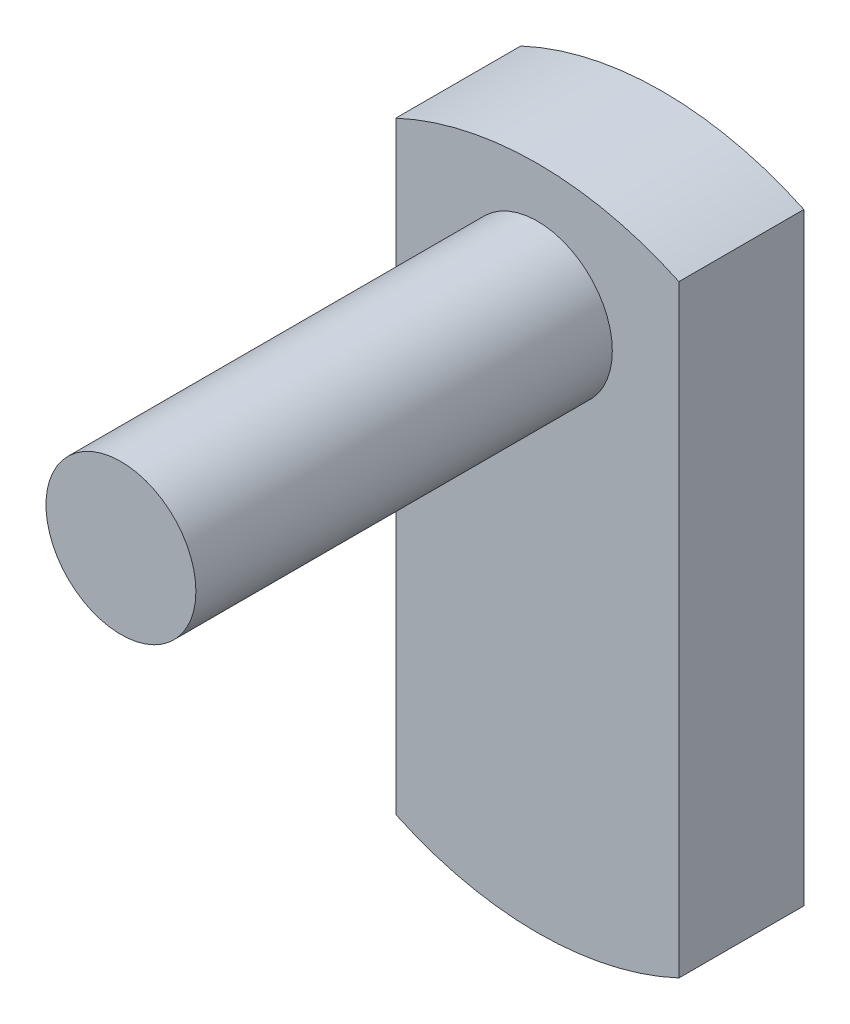
ISO-10303-21;
HEADER;
FILE_DESCRIPTION(('STEP AP214'),'2;1');
FILE_NAME('part.step','',(''),(''),'','','');
FILE_SCHEMA(('AUTOMOTIVE_DESIGN { 1 0 10303 214 1 1 1 1 }'));
ENDSEC;
DATA;
#1=APPLICATION_CONTEXT('core data for automotive mechanical design processes');
#2=APPLICATION_PROTOCOL_DEFINITION('international standard','automotive_design',2000,#1);
#3=PRODUCT_CONTEXT('',#1,'mechanical');
#4=PRODUCT('Part','Part','',(#3));
#5=PRODUCT_RELATED_PRODUCT_CATEGORY('part','',(#4));
#6=PRODUCT_DEFINITION_FORMATION('','',#4);
#7=PRODUCT_DEFINITION_CONTEXT('part definition',#1,'design');
#8=PRODUCT_DEFINITION('design','',#6,#7);
#9=PRODUCT_DEFINITION_SHAPE('','',#8);
#10=(LENGTH_UNIT() NAMED_UNIT(*) SI_UNIT(.MILLI.,.METRE.));
#11=(NAMED_UNIT(*) PLANE_ANGLE_UNIT() SI_UNIT($,.RADIAN.));
#12=(NAMED_UNIT(*) SI_UNIT($,.STERADIAN.) SOLID_ANGLE_UNIT());
#13=UNCERTAINTY_MEASURE_WITH_UNIT(LENGTH_MEASURE(1.E-05),#10,'distance_accuracy_value','');
#14=(GEOMETRIC_REPRESENTATION_CONTEXT(3) GLOBAL_UNCERTAINTY_ASSIGNED_CONTEXT((#13)) GLOBAL_UNIT_ASSIGNED_CONTEXT((#10,
#11,#12)) REPRESENTATION_CONTEXT('',''));
#15=CARTESIAN_POINT('',(0.,0.,0.));
#16=DIRECTION('',(0.,0.,1.));
#17=DIRECTION('',(1.,0.,0.));
#18=AXIS2_PLACEMENT_3D('',#15,#16,#17);
#19=CARTESIAN_POINT('',(0.,0.,15.));
#20=DIRECTION('',(0.,0.,-1.));
#21=DIRECTION('',(-1.,0.,0.));
#22=AXIS2_PLACEMENT_3D('',#19,#20,#21);
#23=CYLINDRICAL_SURFACE('',#22,40.);
#24=CARTESIAN_POINT('',(0.,0.,15.));
#25=DIRECTION('',(0.,0.,1.));
#26=DIRECTION('',(1.,0.,0.));
#27=AXIS2_PLACEMENT_3D('',#24,#25,#26);
#28=CIRCLE('',#27,40.);
#29=CARTESIAN_POINT('',(-17.,-36.2077339804633,15.));
#30=VERTEX_POINT('',#29);
#31=CARTESIAN_POINT('',(17.,-36.2077339804633,15.));
#32=VERTEX_POINT('',#31);
#33=EDGE_CURVE('E46',#30,#32,#28,.T.);
#34=ORIENTED_EDGE('',*,*,#33,.F.);
#35=DIRECTION('',(0.,0.,1.));
#36=VECTOR('',#35,1.);
#37=CARTESIAN_POINT('',(-17.,-36.2077339804633,0.));
#38=LINE('',#37,#36);
#39=CARTESIAN_POINT('',(-17.,-36.2077339804633,0.));
#40=VERTEX_POINT('',#39);
#41=EDGE_CURVE('E103',#40,#30,#38,.T.);
#42=ORIENTED_EDGE('',*,*,#41,.F.);
#43=CARTESIAN_POINT('',(0.,0.,0.));
#44=DIRECTION('',(0.,0.,1.));
#45=DIRECTION('',(1.,0.,0.));
#46=AXIS2_PLACEMENT_3D('',#43,#44,#45);
#47=CIRCLE('',#46,40.);
#48=CARTESIAN_POINT('',(17.,-36.2077339804633,0.));
#49=VERTEX_POINT('',#48);
#50=EDGE_CURVE('E114',#40,#49,#47,.T.);
#51=ORIENTED_EDGE('',*,*,#50,.T.);
#52=DIRECTION('',(0.,0.,1.));
#53=VECTOR('',#52,1.);
#54=CARTESIAN_POINT('',(17.,-36.2077339804633,0.));
#55=LINE('',#54,#53);
#56=EDGE_CURVE('E53',#49,#32,#55,.T.);
#57=ORIENTED_EDGE('',*,*,#56,.T.);
#58=EDGE_LOOP('',(#34,#42,#51,#57));
#59=FACE_BOUND('',#58,.T.);
#60=ADVANCED_FACE('F37',(#59),#23,.T.);
#61=CARTESIAN_POINT('',(17.,36.2077339804633,0.));
#62=VERTEX_POINT('',#61);
#63=CARTESIAN_POINT('',(-17.,36.2077339804633,0.));
#64=VERTEX_POINT('',#63);
#65=EDGE_CURVE('E41',#62,#64,#47,.T.);
#66=ORIENTED_EDGE('',*,*,#65,.T.);
#67=DIRECTION('',(0.,0.,1.));
#68=VECTOR('',#67,1.);
#69=CARTESIAN_POINT('',(-17.,36.2077339804633,0.));
#70=LINE('',#69,#68);
#71=CARTESIAN_POINT('',(-17.,36.2077339804633,15.));
#72=VERTEX_POINT('',#71);
#73=EDGE_CURVE('E61',#64,#72,#70,.T.);
#74=ORIENTED_EDGE('',*,*,#73,.T.);
#75=CARTESIAN_POINT('',(17.,36.2077339804633,15.));
#76=VERTEX_POINT('',#75);
#77=EDGE_CURVE('E11',#76,#72,#28,.T.);
#78=ORIENTED_EDGE('',*,*,#77,.F.);
#79=DIRECTION('',(0.,0.,1.));
#80=VECTOR('',#79,1.);
#81=CARTESIAN_POINT('',(17.,36.2077339804633,0.));
#82=LINE('',#81,#80);
#83=EDGE_CURVE('E160',#62,#76,#82,.T.);
#84=ORIENTED_EDGE('',*,*,#83,.F.);
#85=EDGE_LOOP('',(#66,#74,#78,#84));
#86=FACE_BOUND('',#85,.T.);
#87=ADVANCED_FACE('F39',(#86),#23,.T.);
#88=CARTESIAN_POINT('',(0.,0.,15.));
#89=DIRECTION('',(0.,0.,1.));
#90=DIRECTION('',(1.,0.,0.));
#91=AXIS2_PLACEMENT_3D('',#88,#89,#90);
#92=PLANE('',#91);
#93=DIRECTION('',(0.,1.,0.));
#94=VECTOR('',#93,1.);
#95=CARTESIAN_POINT('',(-17.,36.2077339804633,15.));
#96=LINE('',#95,#94);
#97=EDGE_CURVE('E109',#30,#72,#96,.T.);
#98=ORIENTED_EDGE('',*,*,#97,.F.);
#99=ORIENTED_EDGE('',*,*,#33,.T.);
#100=DIRECTION('',(0.,-1.,0.));
#101=VECTOR('',#100,1.);
#102=CARTESIAN_POINT('',(17.,36.2077339804633,15.));
#103=LINE('',#102,#101);
#104=EDGE_CURVE('E163',#76,#32,#103,.T.);
#105=ORIENTED_EDGE('',*,*,#104,.F.);
#106=ORIENTED_EDGE('',*,*,#77,.T.);
#107=EDGE_LOOP('',(#98,#99,#105,#106));
#108=FACE_BOUND('',#107,.T.);
#109=CARTESIAN_POINT('',(0.,25.,15.));
#110=DIRECTION('',(0.,0.,1.));
#111=DIRECTION('',(1.,0.,0.));
#112=AXIS2_PLACEMENT_3D('',#109,#110,#111);
#113=CIRCLE('',#112,9.);
#114=CARTESIAN_POINT('',(9.,25.,15.));
#115=VERTEX_POINT('',#114);
#116=EDGE_CURVE('E121',#115,#115,#113,.T.);
#117=ORIENTED_EDGE('',*,*,#116,.F.);
#118=EDGE_LOOP('',(#117));
#119=FACE_BOUND('',#118,.T.);
#120=ADVANCED_FACE('F172',(#108,#119),#92,.T.);
#121=CARTESIAN_POINT('',(0.,0.,0.));
#122=DIRECTION('',(0.,0.,1.));
#123=DIRECTION('',(1.,0.,0.));
#124=AXIS2_PLACEMENT_3D('',#121,#122,#123);
#125=PLANE('',#124);
#126=DIRECTION('',(-1.,0.,0.));
#127=VECTOR('',#126,1.);
#128=CARTESIAN_POINT('',(15.,-30.,0.));
#129=LINE('',#128,#127);
#130=CARTESIAN_POINT('',(15.,-30.,0.));
#131=VERTEX_POINT('',#130);
#132=CARTESIAN_POINT('',(-15.,-30.,0.));
#133=VERTEX_POINT('',#132);
#134=EDGE_CURVE('E145',#131,#133,#129,.T.);
#135=ORIENTED_EDGE('',*,*,#134,.F.);
#136=DIRECTION('',(0.,-1.,0.));
#137=VECTOR('',#136,1.);
#138=CARTESIAN_POINT('',(15.,0.,0.));
#139=LINE('',#138,#137);
#140=CARTESIAN_POINT('',(15.,0.,0.));
#141=VERTEX_POINT('',#140);
#142=EDGE_CURVE('E148',#141,#131,#139,.T.);
#143=ORIENTED_EDGE('',*,*,#142,.F.);
#144=DIRECTION('',(1.,0.,0.));
#145=VECTOR('',#144,1.);
#146=CARTESIAN_POINT('',(15.,0.,0.));
#147=LINE('',#146,#145);
#148=CARTESIAN_POINT('',(-15.,0.,0.));
#149=VERTEX_POINT('',#148);
#150=EDGE_CURVE('E138',#149,#141,#147,.T.);
#151=ORIENTED_EDGE('',*,*,#150,.F.);
#152=DIRECTION('',(0.,1.,0.));
#153=VECTOR('',#152,1.);
#154=CARTESIAN_POINT('',(-15.,0.,0.));
#155=LINE('',#154,#153);
#156=EDGE_CURVE('E142',#133,#149,#155,.T.);
#157=ORIENTED_EDGE('',*,*,#156,.F.);
#158=EDGE_LOOP('',(#135,#143,#151,#157));
#159=FACE_BOUND('',#158,.T.);
#160=ORIENTED_EDGE('',*,*,#50,.F.);
#161=DIRECTION('',(0.,1.,0.));
#162=VECTOR('',#161,1.);
#163=CARTESIAN_POINT('',(-17.,36.2077339804633,0.));
#164=LINE('',#163,#162);
#165=EDGE_CURVE('E100',#40,#64,#164,.T.);
#166=ORIENTED_EDGE('',*,*,#165,.T.);
#167=ORIENTED_EDGE('',*,*,#65,.F.);
#168=DIRECTION('',(0.,-1.,0.));
#169=VECTOR('',#168,1.);
#170=CARTESIAN_POINT('',(17.,36.2077339804633,0.));
#171=LINE('',#170,#169);
#172=EDGE_CURVE('E118',#62,#49,#171,.T.);
#173=ORIENTED_EDGE('',*,*,#172,.T.);
#174=EDGE_LOOP('',(#160,#166,#167,#173));
#175=FACE_BOUND('',#174,.T.);
#176=ADVANCED_FACE('F117',(#159,#175),#125,.F.);
#177=CARTESIAN_POINT('',(0.,25.,65.));
#178=DIRECTION('',(0.,0.,-1.));
#179=DIRECTION('',(-1.,0.,0.));
#180=AXIS2_PLACEMENT_3D('',#177,#178,#179);
#181=CYLINDRICAL_SURFACE('',#180,9.);
#182=CARTESIAN_POINT('',(0.,25.,65.));
#183=DIRECTION('',(0.,0.,1.));
#184=DIRECTION('',(1.,0.,0.));
#185=AXIS2_PLACEMENT_3D('',#182,#183,#184);
#186=CIRCLE('',#185,9.);
#187=CARTESIAN_POINT('',(9.,25.,65.));
#188=VERTEX_POINT('',#187);
#189=EDGE_CURVE('E119',#188,#188,#186,.T.);
#190=ORIENTED_EDGE('',*,*,#189,.F.);
#191=EDGE_LOOP('',(#190));
#192=FACE_BOUND('',#191,.T.);
#193=ORIENTED_EDGE('',*,*,#116,.T.);
#194=EDGE_LOOP('',(#193));
#195=FACE_BOUND('',#194,.T.);
#196=ADVANCED_FACE('F197',(#192,#195),#181,.T.);
#197=CARTESIAN_POINT('',(0.,25.,65.));
#198=DIRECTION('',(0.,0.,1.));
#199=DIRECTION('',(1.,0.,0.));
#200=AXIS2_PLACEMENT_3D('',#197,#198,#199);
#201=PLANE('',#200);
#202=ORIENTED_EDGE('',*,*,#189,.T.);
#203=EDGE_LOOP('',(#202));
#204=FACE_BOUND('',#203,.T.);
#205=ADVANCED_FACE('F202',(#204),#201,.T.);
#206=CARTESIAN_POINT('',(15.,0.,10.));
#207=DIRECTION('',(1.,0.,0.));
#208=DIRECTION('',(0.,1.,0.));
#209=AXIS2_PLACEMENT_3D('',#206,#207,#208);
#210=PLANE('',#209);
#211=ORIENTED_EDGE('',*,*,#142,.T.);
#212=DIRECTION('',(0.,0.,-1.));
#213=VECTOR('',#212,1.);
#214=CARTESIAN_POINT('',(15.,-30.,10.));
#215=LINE('',#214,#213);
#216=CARTESIAN_POINT('',(15.,-30.,10.));
#217=VERTEX_POINT('',#216);
#218=EDGE_CURVE('E129',#217,#131,#215,.T.);
#219=ORIENTED_EDGE('',*,*,#218,.F.);
#220=DIRECTION('',(0.,-1.,0.));
#221=VECTOR('',#220,1.);
#222=CARTESIAN_POINT('',(15.,0.,10.));
#223=LINE('',#222,#221);
#224=CARTESIAN_POINT('',(15.,0.,10.));
#225=VERTEX_POINT('',#224);
#226=EDGE_CURVE('E141',#225,#217,#223,.T.);
#227=ORIENTED_EDGE('',*,*,#226,.F.);
#228=DIRECTION('',(0.,0.,-1.));
#229=VECTOR('',#228,1.);
#230=CARTESIAN_POINT('',(15.,0.,10.));
#231=LINE('',#230,#229);
#232=EDGE_CURVE('E126',#225,#141,#231,.T.);
#233=ORIENTED_EDGE('',*,*,#232,.T.);
#234=EDGE_LOOP('',(#211,#219,#227,#233));
#235=FACE_BOUND('',#234,.T.);
#236=ADVANCED_FACE('F206',(#235),#210,.F.);
#237=CARTESIAN_POINT('',(15.,0.,10.));
#238=DIRECTION('',(0.,1.,0.));
#239=DIRECTION('',(0.,0.,1.));
#240=AXIS2_PLACEMENT_3D('',#237,#238,#239);
#241=PLANE('',#240);
#242=ORIENTED_EDGE('',*,*,#150,.T.);
#243=ORIENTED_EDGE('',*,*,#232,.F.);
#244=DIRECTION('',(1.,0.,0.));
#245=VECTOR('',#244,1.);
#246=CARTESIAN_POINT('',(15.,0.,10.));
#247=LINE('',#246,#245);
#248=CARTESIAN_POINT('',(-15.,0.,10.));
#249=VERTEX_POINT('',#248);
#250=EDGE_CURVE('E133',#249,#225,#247,.T.);
#251=ORIENTED_EDGE('',*,*,#250,.F.);
#252=DIRECTION('',(0.,0.,-1.));
#253=VECTOR('',#252,1.);
#254=CARTESIAN_POINT('',(-15.,0.,10.));
#255=LINE('',#254,#253);
#256=EDGE_CURVE('E135',#249,#149,#255,.T.);
#257=ORIENTED_EDGE('',*,*,#256,.T.);
#258=EDGE_LOOP('',(#242,#243,#251,#257));
#259=FACE_BOUND('',#258,.T.);
#260=ADVANCED_FACE('F209',(#259),#241,.F.);
#261=CARTESIAN_POINT('',(-15.,0.,10.));
#262=DIRECTION('',(-1.,0.,0.));
#263=DIRECTION('',(0.,-1.,0.));
#264=AXIS2_PLACEMENT_3D('',#261,#262,#263);
#265=PLANE('',#264);
#266=ORIENTED_EDGE('',*,*,#156,.T.);
#267=ORIENTED_EDGE('',*,*,#256,.F.);
#268=DIRECTION('',(0.,1.,0.));
#269=VECTOR('',#268,1.);
#270=CARTESIAN_POINT('',(-15.,0.,10.));
#271=LINE('',#270,#269);
#272=CARTESIAN_POINT('',(-15.,-30.,10.));
#273=VERTEX_POINT('',#272);
#274=EDGE_CURVE('E152',#273,#249,#271,.T.);
#275=ORIENTED_EDGE('',*,*,#274,.F.);
#276=DIRECTION('',(0.,0.,-1.));
#277=VECTOR('',#276,1.);
#278=CARTESIAN_POINT('',(-15.,-30.,10.));
#279=LINE('',#278,#277);
#280=EDGE_CURVE('E132',#273,#133,#279,.T.);
#281=ORIENTED_EDGE('',*,*,#280,.T.);
#282=EDGE_LOOP('',(#266,#267,#275,#281));
#283=FACE_BOUND('',#282,.T.);
#284=ADVANCED_FACE('F213',(#283),#265,.F.);
#285=CARTESIAN_POINT('',(15.,-30.,10.));
#286=DIRECTION('',(0.,-1.,0.));
#287=DIRECTION('',(1.,0.,0.));
#288=AXIS2_PLACEMENT_3D('',#285,#286,#287);
#289=PLANE('',#288);
#290=ORIENTED_EDGE('',*,*,#134,.T.);
#291=ORIENTED_EDGE('',*,*,#280,.F.);
#292=DIRECTION('',(-1.,0.,0.));
#293=VECTOR('',#292,1.);
#294=CARTESIAN_POINT('',(15.,-30.,10.));
#295=LINE('',#294,#293);
#296=EDGE_CURVE('E155',#217,#273,#295,.T.);
#297=ORIENTED_EDGE('',*,*,#296,.F.);
#298=ORIENTED_EDGE('',*,*,#218,.T.);
#299=EDGE_LOOP('',(#290,#291,#297,#298));
#300=FACE_BOUND('',#299,.T.);
#301=ADVANCED_FACE('F183',(#300),#289,.F.);
#302=CARTESIAN_POINT('',(0.,0.,10.));
#303=DIRECTION('',(0.,0.,-1.));
#304=DIRECTION('',(-1.,0.,0.));
#305=AXIS2_PLACEMENT_3D('',#302,#303,#304);
#306=PLANE('',#305);
#307=ORIENTED_EDGE('',*,*,#226,.T.);
#308=ORIENTED_EDGE('',*,*,#296,.T.);
#309=ORIENTED_EDGE('',*,*,#274,.T.);
#310=ORIENTED_EDGE('',*,*,#250,.T.);
#311=EDGE_LOOP('',(#307,#308,#309,#310));
#312=FACE_BOUND('',#311,.T.);
#313=ADVANCED_FACE('F176',(#312),#306,.T.);
#314=CARTESIAN_POINT('',(17.,36.2077339804633,0.));
#315=DIRECTION('',(-1.,0.,0.));
#316=DIRECTION('',(0.,0.,1.));
#317=AXIS2_PLACEMENT_3D('',#314,#315,#316);
#318=PLANE('',#317);
#319=ORIENTED_EDGE('',*,*,#104,.T.);
#320=ORIENTED_EDGE('',*,*,#56,.F.);
#321=ORIENTED_EDGE('',*,*,#172,.F.);
#322=ORIENTED_EDGE('',*,*,#83,.T.);
#323=EDGE_LOOP('',(#319,#320,#321,#322));
#324=FACE_BOUND('',#323,.T.);
#325=ADVANCED_FACE('F174',(#324),#318,.F.);
#326=CARTESIAN_POINT('',(-17.,36.2077339804633,0.));
#327=DIRECTION('',(1.,0.,0.));
#328=DIRECTION('',(0.,0.,-1.));
#329=AXIS2_PLACEMENT_3D('',#326,#327,#328);
#330=PLANE('',#329);
#331=ORIENTED_EDGE('',*,*,#97,.T.);
#332=ORIENTED_EDGE('',*,*,#73,.F.);
#333=ORIENTED_EDGE('',*,*,#165,.F.);
#334=ORIENTED_EDGE('',*,*,#41,.T.);
#335=EDGE_LOOP('',(#331,#332,#333,#334));
#336=FACE_BOUND('',#335,.T.);
#337=ADVANCED_FACE('F102',(#336),#330,.F.);
#338=CLOSED_SHELL('',(#60,#87,#120,#176,#196,#205,#236,#260,#284,#301,#313,#325,#337));
#339=MANIFOLD_SOLID_BREP('B2',#338);
#340=ADVANCED_BREP_SHAPE_REPRESENTATION('',(#18,#339),#14);
#341=SHAPE_DEFINITION_REPRESENTATION(#9,#340);
ENDSEC;
END-ISO-10303-21;
